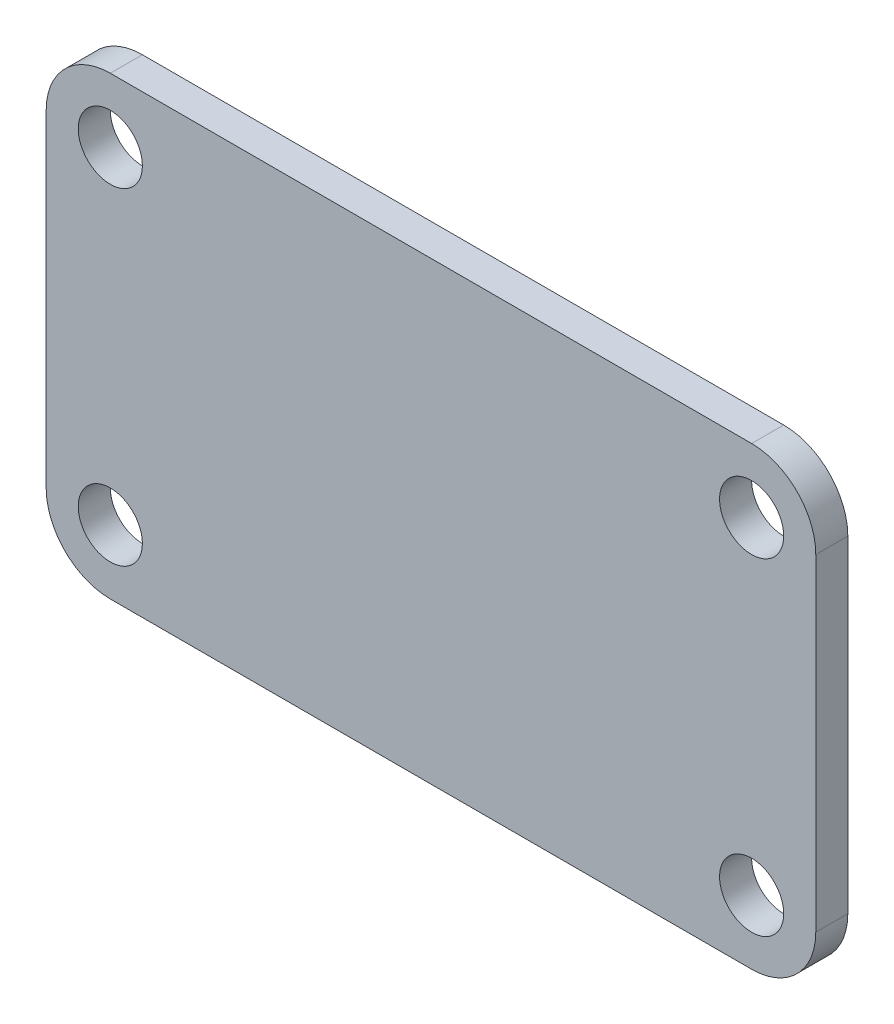
ISO-10303-21;
HEADER;
FILE_DESCRIPTION(('STEP AP214'),'2;1');
FILE_NAME('part.step','',(''),(''),'','','');
FILE_SCHEMA(('AUTOMOTIVE_DESIGN { 1 0 10303 214 1 1 1 1 }'));
ENDSEC;
DATA;
#1=APPLICATION_CONTEXT('core data for automotive mechanical design processes');
#2=APPLICATION_PROTOCOL_DEFINITION('international standard','automotive_design',2000,#1);
#3=PRODUCT_CONTEXT('',#1,'mechanical');
#4=PRODUCT('Part','Part','',(#3));
#5=PRODUCT_RELATED_PRODUCT_CATEGORY('part','',(#4));
#6=PRODUCT_DEFINITION_FORMATION('','',#4);
#7=PRODUCT_DEFINITION_CONTEXT('part definition',#1,'design');
#8=PRODUCT_DEFINITION('design','',#6,#7);
#9=PRODUCT_DEFINITION_SHAPE('','',#8);
#10=(LENGTH_UNIT() NAMED_UNIT(*) SI_UNIT(.MILLI.,.METRE.));
#11=(NAMED_UNIT(*) PLANE_ANGLE_UNIT() SI_UNIT($,.RADIAN.));
#12=(NAMED_UNIT(*) SI_UNIT($,.STERADIAN.) SOLID_ANGLE_UNIT());
#13=UNCERTAINTY_MEASURE_WITH_UNIT(LENGTH_MEASURE(1.E-05),#10,'distance_accuracy_value','');
#14=(GEOMETRIC_REPRESENTATION_CONTEXT(3) GLOBAL_UNCERTAINTY_ASSIGNED_CONTEXT((#13)) GLOBAL_UNIT_ASSIGNED_CONTEXT((#10,
#11,#12)) REPRESENTATION_CONTEXT('',''));
#15=CARTESIAN_POINT('',(0.,0.,0.));
#16=DIRECTION('',(0.,0.,1.));
#17=DIRECTION('',(1.,0.,0.));
#18=AXIS2_PLACEMENT_3D('',#15,#16,#17);
#19=CARTESIAN_POINT('',(0.,0.,1.27));
#20=DIRECTION('',(0.,0.,1.));
#21=DIRECTION('',(1.,0.,0.));
#22=AXIS2_PLACEMENT_3D('',#19,#20,#21);
#23=PLANE('',#22);
#24=CARTESIAN_POINT('',(0.,12.954,1.27));
#25=DIRECTION('',(0.,0.,1.));
#26=DIRECTION('',(1.,0.,0.));
#27=AXIS2_PLACEMENT_3D('',#24,#25,#26);
#28=CIRCLE('',#27,1.27);
#29=CARTESIAN_POINT('',(1.26999999999999,12.954,1.27));
#30=VERTEX_POINT('',#29);
#31=EDGE_CURVE('E187',#30,#30,#28,.T.);
#32=ORIENTED_EDGE('',*,*,#31,.F.);
#33=EDGE_LOOP('',(#32));
#34=FACE_BOUND('',#33,.T.);
#35=CARTESIAN_POINT('',(0.,0.,1.27));
#36=DIRECTION('',(0.,0.,1.));
#37=DIRECTION('',(1.,0.,0.));
#38=AXIS2_PLACEMENT_3D('',#35,#36,#37);
#39=CIRCLE('',#38,1.27);
#40=CARTESIAN_POINT('',(1.27,0.,1.27));
#41=VERTEX_POINT('',#40);
#42=EDGE_CURVE('E173',#41,#41,#39,.T.);
#43=ORIENTED_EDGE('',*,*,#42,.F.);
#44=EDGE_LOOP('',(#43));
#45=FACE_BOUND('',#44,.T.);
#46=DIRECTION('',(0.,-1.,0.));
#47=VECTOR('',#46,1.);
#48=CARTESIAN_POINT('',(-2.54,15.494,1.27));
#49=LINE('',#48,#47);
#50=CARTESIAN_POINT('',(-2.54,12.954,1.27));
#51=VERTEX_POINT('',#50);
#52=CARTESIAN_POINT('',(-2.54,0.,1.27));
#53=VERTEX_POINT('',#52);
#54=EDGE_CURVE('E168',#51,#53,#49,.T.);
#55=ORIENTED_EDGE('',*,*,#54,.T.);
#56=CARTESIAN_POINT('',(0.,0.,1.27));
#57=DIRECTION('',(0.,0.,1.));
#58=DIRECTION('',(1.,0.,0.));
#59=AXIS2_PLACEMENT_3D('',#56,#57,#58);
#60=CIRCLE('',#59,2.54);
#61=CARTESIAN_POINT('',(0.,-2.54,1.27));
#62=VERTEX_POINT('',#61);
#63=EDGE_CURVE('E149',#53,#62,#60,.T.);
#64=ORIENTED_EDGE('',*,*,#63,.T.);
#65=DIRECTION('',(1.,0.,0.));
#66=VECTOR('',#65,1.);
#67=CARTESIAN_POINT('',(-2.54,-2.54,1.27));
#68=LINE('',#67,#66);
#69=CARTESIAN_POINT('',(25.4,-2.54,1.27));
#70=VERTEX_POINT('',#69);
#71=EDGE_CURVE('E119',#62,#70,#68,.T.);
#72=ORIENTED_EDGE('',*,*,#71,.T.);
#73=CARTESIAN_POINT('',(25.4,0.,1.27));
#74=DIRECTION('',(0.,0.,1.));
#75=DIRECTION('',(1.,0.,0.));
#76=AXIS2_PLACEMENT_3D('',#73,#74,#75);
#77=CIRCLE('',#76,2.54);
#78=CARTESIAN_POINT('',(27.94,0.,1.27));
#79=VERTEX_POINT('',#78);
#80=EDGE_CURVE('E55',#70,#79,#77,.T.);
#81=ORIENTED_EDGE('',*,*,#80,.T.);
#82=DIRECTION('',(0.,1.,0.));
#83=VECTOR('',#82,1.);
#84=CARTESIAN_POINT('',(27.94,-2.54,1.27));
#85=LINE('',#84,#83);
#86=CARTESIAN_POINT('',(27.94,12.954,1.27));
#87=VERTEX_POINT('',#86);
#88=EDGE_CURVE('E135',#79,#87,#85,.T.);
#89=ORIENTED_EDGE('',*,*,#88,.T.);
#90=CARTESIAN_POINT('',(25.4,12.954,1.27));
#91=DIRECTION('',(0.,0.,1.));
#92=DIRECTION('',(1.,0.,0.));
#93=AXIS2_PLACEMENT_3D('',#90,#91,#92);
#94=CIRCLE('',#93,2.54);
#95=CARTESIAN_POINT('',(25.4,15.494,1.27));
#96=VERTEX_POINT('',#95);
#97=EDGE_CURVE('E146',#87,#96,#94,.T.);
#98=ORIENTED_EDGE('',*,*,#97,.T.);
#99=DIRECTION('',(-1.,0.,0.));
#100=VECTOR('',#99,1.);
#101=CARTESIAN_POINT('',(27.94,15.494,1.27));
#102=LINE('',#101,#100);
#103=CARTESIAN_POINT('',(0.,15.494,1.27));
#104=VERTEX_POINT('',#103);
#105=EDGE_CURVE('E129',#96,#104,#102,.T.);
#106=ORIENTED_EDGE('',*,*,#105,.T.);
#107=CARTESIAN_POINT('',(0.,12.954,1.27));
#108=DIRECTION('',(0.,0.,1.));
#109=DIRECTION('',(1.,0.,0.));
#110=AXIS2_PLACEMENT_3D('',#107,#108,#109);
#111=CIRCLE('',#110,2.54);
#112=EDGE_CURVE('E144',#104,#51,#111,.T.);
#113=ORIENTED_EDGE('',*,*,#112,.T.);
#114=EDGE_LOOP('',(#55,#64,#72,#81,#89,#98,#106,#113));
#115=FACE_BOUND('',#114,.T.);
#116=CARTESIAN_POINT('',(25.4,12.954,1.27));
#117=DIRECTION('',(0.,0.,1.));
#118=DIRECTION('',(1.,0.,0.));
#119=AXIS2_PLACEMENT_3D('',#116,#117,#118);
#120=CIRCLE('',#119,1.27);
#121=CARTESIAN_POINT('',(26.67,12.954,1.27));
#122=VERTEX_POINT('',#121);
#123=EDGE_CURVE('E182',#122,#122,#120,.T.);
#124=ORIENTED_EDGE('',*,*,#123,.F.);
#125=EDGE_LOOP('',(#124));
#126=FACE_BOUND('',#125,.T.);
#127=CARTESIAN_POINT('',(25.4,0.,1.27));
#128=DIRECTION('',(0.,0.,1.));
#129=DIRECTION('',(1.,0.,0.));
#130=AXIS2_PLACEMENT_3D('',#127,#128,#129);
#131=CIRCLE('',#130,1.27);
#132=CARTESIAN_POINT('',(26.67,0.,1.27));
#133=VERTEX_POINT('',#132);
#134=EDGE_CURVE('E193',#133,#133,#131,.T.);
#135=ORIENTED_EDGE('',*,*,#134,.F.);
#136=EDGE_LOOP('',(#135));
#137=FACE_BOUND('',#136,.T.);
#138=ADVANCED_FACE('F33',(#34,#45,#115,#126,#137),#23,.T.);
#139=CARTESIAN_POINT('',(0.,0.,0.));
#140=DIRECTION('',(0.,0.,1.));
#141=DIRECTION('',(1.,0.,0.));
#142=AXIS2_PLACEMENT_3D('',#139,#140,#141);
#143=PLANE('',#142);
#144=DIRECTION('',(1.,0.,0.));
#145=VECTOR('',#144,1.);
#146=CARTESIAN_POINT('',(-2.54,-2.54,0.));
#147=LINE('',#146,#145);
#148=CARTESIAN_POINT('',(0.,-2.54,0.));
#149=VERTEX_POINT('',#148);
#150=CARTESIAN_POINT('',(25.4,-2.54,0.));
#151=VERTEX_POINT('',#150);
#152=EDGE_CURVE('E117',#149,#151,#147,.T.);
#153=ORIENTED_EDGE('',*,*,#152,.F.);
#154=CARTESIAN_POINT('',(0.,0.,0.));
#155=DIRECTION('',(0.,0.,1.));
#156=DIRECTION('',(1.,0.,0.));
#157=AXIS2_PLACEMENT_3D('',#154,#155,#156);
#158=CIRCLE('',#157,2.54);
#159=CARTESIAN_POINT('',(-2.54,0.,0.));
#160=VERTEX_POINT('',#159);
#161=EDGE_CURVE('E100',#149,#160,#158,.F.);
#162=ORIENTED_EDGE('',*,*,#161,.T.);
#163=DIRECTION('',(0.,-1.,0.));
#164=VECTOR('',#163,1.);
#165=CARTESIAN_POINT('',(-2.54,15.494,0.));
#166=LINE('',#165,#164);
#167=CARTESIAN_POINT('',(-2.54,12.954,0.));
#168=VERTEX_POINT('',#167);
#169=EDGE_CURVE('E127',#168,#160,#166,.T.);
#170=ORIENTED_EDGE('',*,*,#169,.F.);
#171=CARTESIAN_POINT('',(0.,12.954,0.));
#172=DIRECTION('',(0.,0.,1.));
#173=DIRECTION('',(1.,0.,0.));
#174=AXIS2_PLACEMENT_3D('',#171,#172,#173);
#175=CIRCLE('',#174,2.54);
#176=CARTESIAN_POINT('',(0.,15.494,0.));
#177=VERTEX_POINT('',#176);
#178=EDGE_CURVE('E120',#168,#177,#175,.F.);
#179=ORIENTED_EDGE('',*,*,#178,.T.);
#180=DIRECTION('',(-1.,0.,0.));
#181=VECTOR('',#180,1.);
#182=CARTESIAN_POINT('',(27.94,15.494,0.));
#183=LINE('',#182,#181);
#184=CARTESIAN_POINT('',(25.4,15.494,0.));
#185=VERTEX_POINT('',#184);
#186=EDGE_CURVE('E131',#185,#177,#183,.T.);
#187=ORIENTED_EDGE('',*,*,#186,.F.);
#188=CARTESIAN_POINT('',(25.4,12.954,0.));
#189=DIRECTION('',(0.,0.,1.));
#190=DIRECTION('',(1.,0.,0.));
#191=AXIS2_PLACEMENT_3D('',#188,#189,#190);
#192=CIRCLE('',#191,2.54);
#193=CARTESIAN_POINT('',(27.94,12.954,0.));
#194=VERTEX_POINT('',#193);
#195=EDGE_CURVE('E138',#185,#194,#192,.F.);
#196=ORIENTED_EDGE('',*,*,#195,.T.);
#197=DIRECTION('',(0.,1.,0.));
#198=VECTOR('',#197,1.);
#199=CARTESIAN_POINT('',(27.94,-2.54,0.));
#200=LINE('',#199,#198);
#201=CARTESIAN_POINT('',(27.94,0.,0.));
#202=VERTEX_POINT('',#201);
#203=EDGE_CURVE('E126',#202,#194,#200,.T.);
#204=ORIENTED_EDGE('',*,*,#203,.F.);
#205=CARTESIAN_POINT('',(25.4,0.,0.));
#206=DIRECTION('',(0.,0.,1.));
#207=DIRECTION('',(1.,0.,0.));
#208=AXIS2_PLACEMENT_3D('',#205,#206,#207);
#209=CIRCLE('',#208,2.54);
#210=EDGE_CURVE('E111',#202,#151,#209,.F.);
#211=ORIENTED_EDGE('',*,*,#210,.T.);
#212=EDGE_LOOP('',(#153,#162,#170,#179,#187,#196,#204,#211));
#213=FACE_BOUND('',#212,.T.);
#214=CARTESIAN_POINT('',(0.,0.,0.));
#215=DIRECTION('',(0.,0.,1.));
#216=DIRECTION('',(1.,0.,0.));
#217=AXIS2_PLACEMENT_3D('',#214,#215,#216);
#218=CIRCLE('',#217,1.27);
#219=CARTESIAN_POINT('',(1.27,0.,0.));
#220=VERTEX_POINT('',#219);
#221=EDGE_CURVE('E175',#220,#220,#218,.T.);
#222=ORIENTED_EDGE('',*,*,#221,.T.);
#223=EDGE_LOOP('',(#222));
#224=FACE_BOUND('',#223,.T.);
#225=CARTESIAN_POINT('',(25.4,12.954,0.));
#226=DIRECTION('',(0.,0.,1.));
#227=DIRECTION('',(1.,0.,0.));
#228=AXIS2_PLACEMENT_3D('',#225,#226,#227);
#229=CIRCLE('',#228,1.27);
#230=CARTESIAN_POINT('',(26.67,12.954,0.));
#231=VERTEX_POINT('',#230);
#232=EDGE_CURVE('E184',#231,#231,#229,.T.);
#233=ORIENTED_EDGE('',*,*,#232,.T.);
#234=EDGE_LOOP('',(#233));
#235=FACE_BOUND('',#234,.T.);
#236=CARTESIAN_POINT('',(0.,12.954,0.));
#237=DIRECTION('',(0.,0.,1.));
#238=DIRECTION('',(1.,0.,0.));
#239=AXIS2_PLACEMENT_3D('',#236,#237,#238);
#240=CIRCLE('',#239,1.27);
#241=CARTESIAN_POINT('',(1.26999999999999,12.954,0.));
#242=VERTEX_POINT('',#241);
#243=EDGE_CURVE('E190',#242,#242,#240,.T.);
#244=ORIENTED_EDGE('',*,*,#243,.T.);
#245=EDGE_LOOP('',(#244));
#246=FACE_BOUND('',#245,.T.);
#247=CARTESIAN_POINT('',(25.4,0.,0.));
#248=DIRECTION('',(0.,0.,1.));
#249=DIRECTION('',(1.,0.,0.));
#250=AXIS2_PLACEMENT_3D('',#247,#248,#249);
#251=CIRCLE('',#250,1.27);
#252=CARTESIAN_POINT('',(26.67,0.,0.));
#253=VERTEX_POINT('',#252);
#254=EDGE_CURVE('E196',#253,#253,#251,.T.);
#255=ORIENTED_EDGE('',*,*,#254,.T.);
#256=EDGE_LOOP('',(#255));
#257=FACE_BOUND('',#256,.T.);
#258=ADVANCED_FACE('F123',(#213,#224,#235,#246,#257),#143,.F.);
#259=CARTESIAN_POINT('',(27.94,15.494,1.27));
#260=DIRECTION('',(0.,-1.,0.));
#261=DIRECTION('',(1.,0.,0.));
#262=AXIS2_PLACEMENT_3D('',#259,#260,#261);
#263=PLANE('',#262);
#264=ORIENTED_EDGE('',*,*,#105,.F.);
#265=DIRECTION('',(0.,0.,-1.));
#266=VECTOR('',#265,1.);
#267=CARTESIAN_POINT('',(25.4,15.494,1.27));
#268=LINE('',#267,#266);
#269=EDGE_CURVE('E11',#96,#185,#268,.T.);
#270=ORIENTED_EDGE('',*,*,#269,.T.);
#271=ORIENTED_EDGE('',*,*,#186,.T.);
#272=DIRECTION('',(0.,0.,-1.));
#273=VECTOR('',#272,1.);
#274=CARTESIAN_POINT('',(0.,15.494,1.27));
#275=LINE('',#274,#273);
#276=EDGE_CURVE('E41',#177,#104,#275,.F.);
#277=ORIENTED_EDGE('',*,*,#276,.T.);
#278=EDGE_LOOP('',(#264,#270,#271,#277));
#279=FACE_BOUND('',#278,.T.);
#280=ADVANCED_FACE('F159',(#279),#263,.F.);
#281=CARTESIAN_POINT('',(-2.54,15.494,1.27));
#282=DIRECTION('',(1.,0.,0.));
#283=DIRECTION('',(0.,0.,-1.));
#284=AXIS2_PLACEMENT_3D('',#281,#282,#283);
#285=PLANE('',#284);
#286=ORIENTED_EDGE('',*,*,#169,.T.);
#287=DIRECTION('',(0.,0.,-1.));
#288=VECTOR('',#287,1.);
#289=CARTESIAN_POINT('',(-2.54,0.,1.27));
#290=LINE('',#289,#288);
#291=EDGE_CURVE('E105',#160,#53,#290,.F.);
#292=ORIENTED_EDGE('',*,*,#291,.T.);
#293=ORIENTED_EDGE('',*,*,#54,.F.);
#294=DIRECTION('',(0.,0.,-1.));
#295=VECTOR('',#294,1.);
#296=CARTESIAN_POINT('',(-2.54,12.954,1.27));
#297=LINE('',#296,#295);
#298=EDGE_CURVE('E110',#51,#168,#297,.T.);
#299=ORIENTED_EDGE('',*,*,#298,.T.);
#300=EDGE_LOOP('',(#286,#292,#293,#299));
#301=FACE_BOUND('',#300,.T.);
#302=ADVANCED_FACE('F172',(#301),#285,.F.);
#303=CARTESIAN_POINT('',(-2.54,-2.54,1.27));
#304=DIRECTION('',(0.,1.,0.));
#305=DIRECTION('',(0.,0.,1.));
#306=AXIS2_PLACEMENT_3D('',#303,#304,#305);
#307=PLANE('',#306);
#308=ORIENTED_EDGE('',*,*,#71,.F.);
#309=DIRECTION('',(0.,0.,-1.));
#310=VECTOR('',#309,1.);
#311=CARTESIAN_POINT('',(0.,-2.54,1.27));
#312=LINE('',#311,#310);
#313=EDGE_CURVE('E104',#62,#149,#312,.T.);
#314=ORIENTED_EDGE('',*,*,#313,.T.);
#315=ORIENTED_EDGE('',*,*,#152,.T.);
#316=DIRECTION('',(0.,0.,-1.));
#317=VECTOR('',#316,1.);
#318=CARTESIAN_POINT('',(25.4,-2.54,1.27));
#319=LINE('',#318,#317);
#320=EDGE_CURVE('E121',#151,#70,#319,.F.);
#321=ORIENTED_EDGE('',*,*,#320,.T.);
#322=EDGE_LOOP('',(#308,#314,#315,#321));
#323=FACE_BOUND('',#322,.T.);
#324=ADVANCED_FACE('F116',(#323),#307,.F.);
#325=CARTESIAN_POINT('',(27.94,-2.54,1.27));
#326=DIRECTION('',(-1.,0.,0.));
#327=DIRECTION('',(0.,0.,1.));
#328=AXIS2_PLACEMENT_3D('',#325,#326,#327);
#329=PLANE('',#328);
#330=ORIENTED_EDGE('',*,*,#88,.F.);
#331=DIRECTION('',(0.,0.,-1.));
#332=VECTOR('',#331,1.);
#333=CARTESIAN_POINT('',(27.94,0.,1.27));
#334=LINE('',#333,#332);
#335=EDGE_CURVE('E152',#79,#202,#334,.T.);
#336=ORIENTED_EDGE('',*,*,#335,.T.);
#337=ORIENTED_EDGE('',*,*,#203,.T.);
#338=DIRECTION('',(0.,0.,-1.));
#339=VECTOR('',#338,1.);
#340=CARTESIAN_POINT('',(27.94,12.954,1.27));
#341=LINE('',#340,#339);
#342=EDGE_CURVE('E48',#194,#87,#341,.F.);
#343=ORIENTED_EDGE('',*,*,#342,.T.);
#344=EDGE_LOOP('',(#330,#336,#337,#343));
#345=FACE_BOUND('',#344,.T.);
#346=ADVANCED_FACE('F218',(#345),#329,.F.);
#347=CARTESIAN_POINT('',(0.,0.,1.27));
#348=DIRECTION('',(0.,0.,-1.));
#349=DIRECTION('',(-1.,0.,0.));
#350=AXIS2_PLACEMENT_3D('',#347,#348,#349);
#351=CYLINDRICAL_SURFACE('',#350,1.27);
#352=ORIENTED_EDGE('',*,*,#42,.T.);
#353=EDGE_LOOP('',(#352));
#354=FACE_BOUND('',#353,.T.);
#355=ORIENTED_EDGE('',*,*,#221,.F.);
#356=EDGE_LOOP('',(#355));
#357=FACE_BOUND('',#356,.T.);
#358=ADVANCED_FACE('F215',(#354,#357),#351,.F.);
#359=CARTESIAN_POINT('',(25.4,12.954,1.27));
#360=DIRECTION('',(0.,0.,-1.));
#361=DIRECTION('',(-1.,0.,0.));
#362=AXIS2_PLACEMENT_3D('',#359,#360,#361);
#363=CYLINDRICAL_SURFACE('',#362,1.27);
#364=ORIENTED_EDGE('',*,*,#123,.T.);
#365=EDGE_LOOP('',(#364));
#366=FACE_BOUND('',#365,.T.);
#367=ORIENTED_EDGE('',*,*,#232,.F.);
#368=EDGE_LOOP('',(#367));
#369=FACE_BOUND('',#368,.T.);
#370=ADVANCED_FACE('F310',(#366,#369),#363,.F.);
#371=CARTESIAN_POINT('',(0.,12.954,1.27));
#372=DIRECTION('',(0.,0.,-1.));
#373=DIRECTION('',(-1.,0.,0.));
#374=AXIS2_PLACEMENT_3D('',#371,#372,#373);
#375=CYLINDRICAL_SURFACE('',#374,1.27);
#376=ORIENTED_EDGE('',*,*,#31,.T.);
#377=EDGE_LOOP('',(#376));
#378=FACE_BOUND('',#377,.T.);
#379=ORIENTED_EDGE('',*,*,#243,.F.);
#380=EDGE_LOOP('',(#379));
#381=FACE_BOUND('',#380,.T.);
#382=ADVANCED_FACE('F301',(#378,#381),#375,.F.);
#383=CARTESIAN_POINT('',(25.4,0.,1.27));
#384=DIRECTION('',(0.,0.,-1.));
#385=DIRECTION('',(-1.,0.,0.));
#386=AXIS2_PLACEMENT_3D('',#383,#384,#385);
#387=CYLINDRICAL_SURFACE('',#386,1.27);
#388=ORIENTED_EDGE('',*,*,#134,.T.);
#389=EDGE_LOOP('',(#388));
#390=FACE_BOUND('',#389,.T.);
#391=ORIENTED_EDGE('',*,*,#254,.F.);
#392=EDGE_LOOP('',(#391));
#393=FACE_BOUND('',#392,.T.);
#394=ADVANCED_FACE('F202',(#390,#393),#387,.F.);
#395=CARTESIAN_POINT('',(0.,0.,1.27));
#396=DIRECTION('',(0.,0.,-1.));
#397=DIRECTION('',(-1.,0.,0.));
#398=AXIS2_PLACEMENT_3D('',#395,#396,#397);
#399=CYLINDRICAL_SURFACE('',#398,2.54);
#400=ORIENTED_EDGE('',*,*,#63,.F.);
#401=ORIENTED_EDGE('',*,*,#291,.F.);
#402=ORIENTED_EDGE('',*,*,#161,.F.);
#403=ORIENTED_EDGE('',*,*,#313,.F.);
#404=EDGE_LOOP('',(#400,#401,#402,#403));
#405=FACE_BOUND('',#404,.T.);
#406=ADVANCED_FACE('F103',(#405),#399,.T.);
#407=CARTESIAN_POINT('',(25.4,0.,1.27));
#408=DIRECTION('',(0.,0.,-1.));
#409=DIRECTION('',(-1.,0.,0.));
#410=AXIS2_PLACEMENT_3D('',#407,#408,#409);
#411=CYLINDRICAL_SURFACE('',#410,2.54);
#412=ORIENTED_EDGE('',*,*,#80,.F.);
#413=ORIENTED_EDGE('',*,*,#320,.F.);
#414=ORIENTED_EDGE('',*,*,#210,.F.);
#415=ORIENTED_EDGE('',*,*,#335,.F.);
#416=EDGE_LOOP('',(#412,#413,#414,#415));
#417=FACE_BOUND('',#416,.T.);
#418=ADVANCED_FACE('F229',(#417),#411,.T.);
#419=CARTESIAN_POINT('',(25.4,12.954,1.27));
#420=DIRECTION('',(0.,0.,-1.));
#421=DIRECTION('',(-1.,0.,0.));
#422=AXIS2_PLACEMENT_3D('',#419,#420,#421);
#423=CYLINDRICAL_SURFACE('',#422,2.54);
#424=ORIENTED_EDGE('',*,*,#97,.F.);
#425=ORIENTED_EDGE('',*,*,#342,.F.);
#426=ORIENTED_EDGE('',*,*,#195,.F.);
#427=ORIENTED_EDGE('',*,*,#269,.F.);
#428=EDGE_LOOP('',(#424,#425,#426,#427));
#429=FACE_BOUND('',#428,.T.);
#430=ADVANCED_FACE('F231',(#429),#423,.T.);
#431=CARTESIAN_POINT('',(0.,12.954,1.27));
#432=DIRECTION('',(0.,0.,-1.));
#433=DIRECTION('',(-1.,0.,0.));
#434=AXIS2_PLACEMENT_3D('',#431,#432,#433);
#435=CYLINDRICAL_SURFACE('',#434,2.54);
#436=ORIENTED_EDGE('',*,*,#112,.F.);
#437=ORIENTED_EDGE('',*,*,#276,.F.);
#438=ORIENTED_EDGE('',*,*,#178,.F.);
#439=ORIENTED_EDGE('',*,*,#298,.F.);
#440=EDGE_LOOP('',(#436,#437,#438,#439));
#441=FACE_BOUND('',#440,.T.);
#442=ADVANCED_FACE('F35',(#441),#435,.T.);
#443=CLOSED_SHELL('',(#138,#258,#280,#302,#324,#346,#358,#370,#382,#394,#406,#418,#430,#442));
#444=MANIFOLD_SOLID_BREP('B2',#443);
#445=ADVANCED_BREP_SHAPE_REPRESENTATION('',(#18,#444),#14);
#446=SHAPE_DEFINITION_REPRESENTATION(#9,#445);
ENDSEC;
END-ISO-10303-21;
